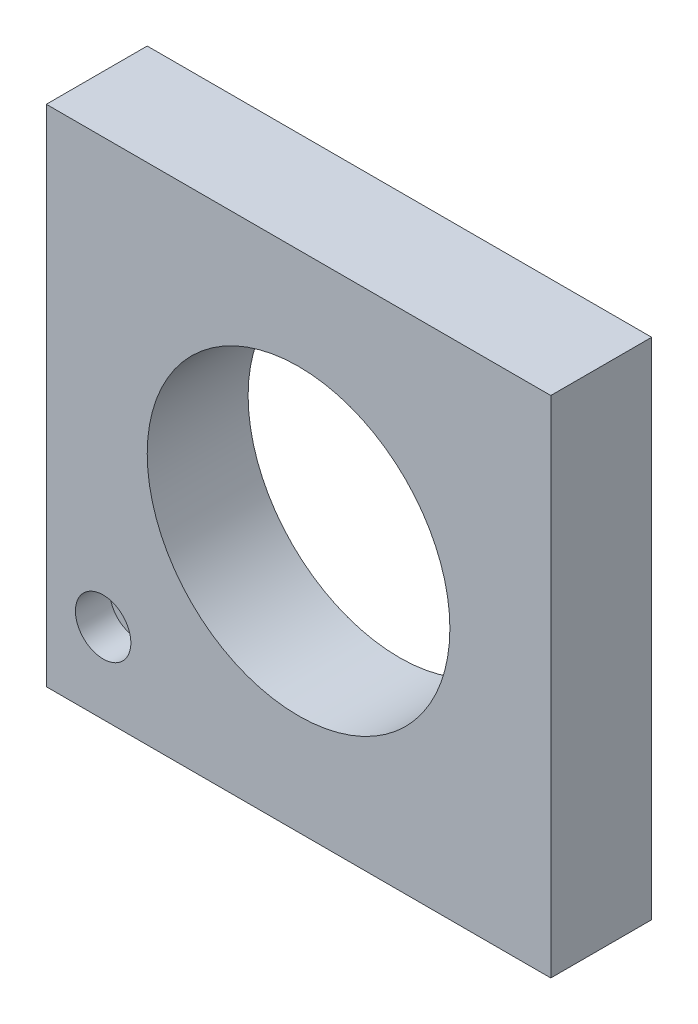
ISO-10303-21;
HEADER;
FILE_DESCRIPTION(('STEP AP214'),'2;1');
FILE_NAME('part.step','',(''),(''),'','','');
FILE_SCHEMA(('AUTOMOTIVE_DESIGN { 1 0 10303 214 1 1 1 1 }'));
ENDSEC;
DATA;
#1=APPLICATION_CONTEXT('core data for automotive mechanical design processes');
#2=APPLICATION_PROTOCOL_DEFINITION('international standard','automotive_design',2000,#1);
#3=PRODUCT_CONTEXT('',#1,'mechanical');
#4=PRODUCT('Part','Part','',(#3));
#5=PRODUCT_RELATED_PRODUCT_CATEGORY('part','',(#4));
#6=PRODUCT_DEFINITION_FORMATION('','',#4);
#7=PRODUCT_DEFINITION_CONTEXT('part definition',#1,'design');
#8=PRODUCT_DEFINITION('design','',#6,#7);
#9=PRODUCT_DEFINITION_SHAPE('','',#8);
#10=(LENGTH_UNIT() NAMED_UNIT(*) SI_UNIT(.MILLI.,.METRE.));
#11=(NAMED_UNIT(*) PLANE_ANGLE_UNIT() SI_UNIT($,.RADIAN.));
#12=(NAMED_UNIT(*) SI_UNIT($,.STERADIAN.) SOLID_ANGLE_UNIT());
#13=UNCERTAINTY_MEASURE_WITH_UNIT(LENGTH_MEASURE(1.E-05),#10,'distance_accuracy_value','');
#14=(GEOMETRIC_REPRESENTATION_CONTEXT(3) GLOBAL_UNCERTAINTY_ASSIGNED_CONTEXT((#13)) GLOBAL_UNIT_ASSIGNED_CONTEXT((#10,
#11,#12)) REPRESENTATION_CONTEXT('',''));
#15=CARTESIAN_POINT('',(0.,0.,0.));
#16=DIRECTION('',(0.,0.,1.));
#17=DIRECTION('',(1.,0.,0.));
#18=AXIS2_PLACEMENT_3D('',#15,#16,#17);
#19=CARTESIAN_POINT('',(50.,-50.,20.));
#20=DIRECTION('',(-1.,0.,0.));
#21=DIRECTION('',(0.,0.,1.));
#22=AXIS2_PLACEMENT_3D('',#19,#20,#21);
#23=PLANE('',#22);
#24=DIRECTION('',(0.,1.,0.));
#25=VECTOR('',#24,1.);
#26=CARTESIAN_POINT('',(50.,-50.,0.));
#27=LINE('',#26,#25);
#28=CARTESIAN_POINT('',(50.,-50.,0.));
#29=VERTEX_POINT('',#28);
#30=CARTESIAN_POINT('',(50.,50.,0.));
#31=VERTEX_POINT('',#30);
#32=EDGE_CURVE('E113',#29,#31,#27,.T.);
#33=ORIENTED_EDGE('',*,*,#32,.T.);
#34=DIRECTION('',(0.,0.,-1.));
#35=VECTOR('',#34,1.);
#36=CARTESIAN_POINT('',(50.,50.,20.));
#37=LINE('',#36,#35);
#38=CARTESIAN_POINT('',(50.,50.,20.));
#39=VERTEX_POINT('',#38);
#40=EDGE_CURVE('E11',#39,#31,#37,.T.);
#41=ORIENTED_EDGE('',*,*,#40,.F.);
#42=DIRECTION('',(0.,1.,0.));
#43=VECTOR('',#42,1.);
#44=CARTESIAN_POINT('',(50.,-50.,20.));
#45=LINE('',#44,#43);
#46=CARTESIAN_POINT('',(50.,-50.,20.));
#47=VERTEX_POINT('',#46);
#48=EDGE_CURVE('E97',#47,#39,#45,.T.);
#49=ORIENTED_EDGE('',*,*,#48,.F.);
#50=DIRECTION('',(0.,0.,-1.));
#51=VECTOR('',#50,1.);
#52=CARTESIAN_POINT('',(50.,-50.,20.));
#53=LINE('',#52,#51);
#54=EDGE_CURVE('E109',#47,#29,#53,.T.);
#55=ORIENTED_EDGE('',*,*,#54,.T.);
#56=EDGE_LOOP('',(#33,#41,#49,#55));
#57=FACE_BOUND('',#56,.T.);
#58=ADVANCED_FACE('F45',(#57),#23,.F.);
#59=CARTESIAN_POINT('',(-50.,50.,20.));
#60=DIRECTION('',(0.,-1.,0.));
#61=DIRECTION('',(0.,0.,-1.));
#62=AXIS2_PLACEMENT_3D('',#59,#60,#61);
#63=PLANE('',#62);
#64=DIRECTION('',(-1.,0.,0.));
#65=VECTOR('',#64,1.);
#66=CARTESIAN_POINT('',(-50.,50.,0.));
#67=LINE('',#66,#65);
#68=CARTESIAN_POINT('',(-50.,50.,0.));
#69=VERTEX_POINT('',#68);
#70=EDGE_CURVE('E102',#31,#69,#67,.T.);
#71=ORIENTED_EDGE('',*,*,#70,.T.);
#72=DIRECTION('',(0.,0.,-1.));
#73=VECTOR('',#72,1.);
#74=CARTESIAN_POINT('',(-50.,50.,20.));
#75=LINE('',#74,#73);
#76=CARTESIAN_POINT('',(-50.,50.,20.));
#77=VERTEX_POINT('',#76);
#78=EDGE_CURVE('E54',#77,#69,#75,.T.);
#79=ORIENTED_EDGE('',*,*,#78,.F.);
#80=DIRECTION('',(-1.,0.,0.));
#81=VECTOR('',#80,1.);
#82=CARTESIAN_POINT('',(-50.,50.,20.));
#83=LINE('',#82,#81);
#84=EDGE_CURVE('E92',#39,#77,#83,.T.);
#85=ORIENTED_EDGE('',*,*,#84,.F.);
#86=ORIENTED_EDGE('',*,*,#40,.T.);
#87=EDGE_LOOP('',(#71,#79,#85,#86));
#88=FACE_BOUND('',#87,.T.);
#89=ADVANCED_FACE('F101',(#88),#63,.F.);
#90=CARTESIAN_POINT('',(-50.,-50.,20.));
#91=DIRECTION('',(1.,0.,0.));
#92=DIRECTION('',(0.,0.,-1.));
#93=AXIS2_PLACEMENT_3D('',#90,#91,#92);
#94=PLANE('',#93);
#95=DIRECTION('',(0.,-1.,0.));
#96=VECTOR('',#95,1.);
#97=CARTESIAN_POINT('',(-50.,-50.,0.));
#98=LINE('',#97,#96);
#99=CARTESIAN_POINT('',(-50.,-50.,0.));
#100=VERTEX_POINT('',#99);
#101=EDGE_CURVE('E79',#69,#100,#98,.T.);
#102=ORIENTED_EDGE('',*,*,#101,.T.);
#103=DIRECTION('',(0.,0.,-1.));
#104=VECTOR('',#103,1.);
#105=CARTESIAN_POINT('',(-50.,-50.,20.));
#106=LINE('',#105,#104);
#107=CARTESIAN_POINT('',(-50.,-50.,20.));
#108=VERTEX_POINT('',#107);
#109=EDGE_CURVE('E104',#108,#100,#106,.T.);
#110=ORIENTED_EDGE('',*,*,#109,.F.);
#111=DIRECTION('',(0.,-1.,0.));
#112=VECTOR('',#111,1.);
#113=CARTESIAN_POINT('',(-50.,-50.,20.));
#114=LINE('',#113,#112);
#115=EDGE_CURVE('E95',#77,#108,#114,.T.);
#116=ORIENTED_EDGE('',*,*,#115,.F.);
#117=ORIENTED_EDGE('',*,*,#78,.T.);
#118=EDGE_LOOP('',(#102,#110,#116,#117));
#119=FACE_BOUND('',#118,.T.);
#120=ADVANCED_FACE('F105',(#119),#94,.F.);
#121=CARTESIAN_POINT('',(-50.,-50.,20.));
#122=DIRECTION('',(0.,1.,0.));
#123=DIRECTION('',(0.,0.,1.));
#124=AXIS2_PLACEMENT_3D('',#121,#122,#123);
#125=PLANE('',#124);
#126=DIRECTION('',(1.,0.,0.));
#127=VECTOR('',#126,1.);
#128=CARTESIAN_POINT('',(-50.,-50.,0.));
#129=LINE('',#128,#127);
#130=EDGE_CURVE('E85',#100,#29,#129,.T.);
#131=ORIENTED_EDGE('',*,*,#130,.T.);
#132=ORIENTED_EDGE('',*,*,#54,.F.);
#133=DIRECTION('',(1.,0.,0.));
#134=VECTOR('',#133,1.);
#135=CARTESIAN_POINT('',(-50.,-50.,20.));
#136=LINE('',#135,#134);
#137=EDGE_CURVE('E62',#108,#47,#136,.T.);
#138=ORIENTED_EDGE('',*,*,#137,.F.);
#139=ORIENTED_EDGE('',*,*,#109,.T.);
#140=EDGE_LOOP('',(#131,#132,#138,#139));
#141=FACE_BOUND('',#140,.T.);
#142=ADVANCED_FACE('F127',(#141),#125,.F.);
#143=CARTESIAN_POINT('',(0.,0.,20.));
#144=DIRECTION('',(0.,0.,-1.));
#145=DIRECTION('',(-1.,0.,0.));
#146=AXIS2_PLACEMENT_3D('',#143,#144,#145);
#147=PLANE('',#146);
#148=CARTESIAN_POINT('',(-38.736943886363,-34.1032488673534,20.));
#149=DIRECTION('',(0.,0.,1.));
#150=DIRECTION('',(1.,0.,0.));
#151=AXIS2_PLACEMENT_3D('',#148,#149,#150);
#152=CIRCLE('',#151,5.5);
#153=CARTESIAN_POINT('',(-33.236943886363,-34.1032488673534,20.));
#154=VERTEX_POINT('',#153);
#155=EDGE_CURVE('E157',#154,#154,#152,.T.);
#156=ORIENTED_EDGE('',*,*,#155,.F.);
#157=EDGE_LOOP('',(#156));
#158=FACE_BOUND('',#157,.T.);
#159=CARTESIAN_POINT('',(0.,0.,20.));
#160=DIRECTION('',(0.,0.,1.));
#161=DIRECTION('',(1.,0.,0.));
#162=AXIS2_PLACEMENT_3D('',#159,#160,#161);
#163=CIRCLE('',#162,30.);
#164=CARTESIAN_POINT('',(30.,0.,20.));
#165=VERTEX_POINT('',#164);
#166=EDGE_CURVE('E137',#165,#165,#163,.T.);
#167=ORIENTED_EDGE('',*,*,#166,.F.);
#168=EDGE_LOOP('',(#167));
#169=FACE_BOUND('',#168,.T.);
#170=ORIENTED_EDGE('',*,*,#48,.T.);
#171=ORIENTED_EDGE('',*,*,#84,.T.);
#172=ORIENTED_EDGE('',*,*,#115,.T.);
#173=ORIENTED_EDGE('',*,*,#137,.T.);
#174=EDGE_LOOP('',(#170,#171,#172,#173));
#175=FACE_BOUND('',#174,.T.);
#176=ADVANCED_FACE('F93',(#158,#169,#175),#147,.F.);
#177=CARTESIAN_POINT('',(0.,0.,0.));
#178=DIRECTION('',(0.,0.,-1.));
#179=DIRECTION('',(-1.,0.,0.));
#180=AXIS2_PLACEMENT_3D('',#177,#178,#179);
#181=PLANE('',#180);
#182=CARTESIAN_POINT('',(-38.736943886363,-34.1032488673534,0.));
#183=DIRECTION('',(0.,0.,1.));
#184=DIRECTION('',(1.,0.,0.));
#185=AXIS2_PLACEMENT_3D('',#182,#183,#184);
#186=CIRCLE('',#185,3.3);
#187=CARTESIAN_POINT('',(-35.436943886363,-34.1032488673534,0.));
#188=VERTEX_POINT('',#187);
#189=EDGE_CURVE('E141',#188,#188,#186,.T.);
#190=ORIENTED_EDGE('',*,*,#189,.T.);
#191=EDGE_LOOP('',(#190));
#192=FACE_BOUND('',#191,.T.);
#193=CARTESIAN_POINT('',(0.,0.,0.));
#194=DIRECTION('',(0.,0.,-1.));
#195=DIRECTION('',(-1.,0.,0.));
#196=AXIS2_PLACEMENT_3D('',#193,#194,#195);
#197=CIRCLE('',#196,30.);
#198=CARTESIAN_POINT('',(-30.,0.,0.));
#199=VERTEX_POINT('',#198);
#200=EDGE_CURVE('E117',#199,#199,#197,.F.);
#201=ORIENTED_EDGE('',*,*,#200,.T.);
#202=EDGE_LOOP('',(#201));
#203=FACE_BOUND('',#202,.T.);
#204=ORIENTED_EDGE('',*,*,#32,.F.);
#205=ORIENTED_EDGE('',*,*,#130,.F.);
#206=ORIENTED_EDGE('',*,*,#101,.F.);
#207=ORIENTED_EDGE('',*,*,#70,.F.);
#208=EDGE_LOOP('',(#204,#205,#206,#207));
#209=FACE_BOUND('',#208,.T.);
#210=ADVANCED_FACE('F130',(#192,#203,#209),#181,.T.);
#211=CARTESIAN_POINT('',(0.,0.,-84.8528137423857));
#212=DIRECTION('',(0.,0.,1.));
#213=DIRECTION('',(1.,0.,0.));
#214=AXIS2_PLACEMENT_3D('',#211,#212,#213);
#215=CYLINDRICAL_SURFACE('',#214,30.);
#216=ORIENTED_EDGE('',*,*,#166,.T.);
#217=EDGE_LOOP('',(#216));
#218=FACE_BOUND('',#217,.T.);
#219=ORIENTED_EDGE('',*,*,#200,.F.);
#220=EDGE_LOOP('',(#219));
#221=FACE_BOUND('',#220,.T.);
#222=ADVANCED_FACE('F169',(#218,#221),#215,.F.);
#223=CARTESIAN_POINT('',(-38.736943886363,-34.1032488673534,20.));
#224=DIRECTION('',(0.,0.,1.));
#225=DIRECTION('',(1.,0.,0.));
#226=AXIS2_PLACEMENT_3D('',#223,#224,#225);
#227=CYLINDRICAL_SURFACE('',#226,3.3);
#228=ORIENTED_EDGE('',*,*,#189,.F.);
#229=EDGE_LOOP('',(#228));
#230=FACE_BOUND('',#229,.T.);
#231=CARTESIAN_POINT('',(-38.736943886363,-34.1032488673534,13.1849784845243));
#232=DIRECTION('',(0.,0.,1.));
#233=DIRECTION('',(1.,0.,0.));
#234=AXIS2_PLACEMENT_3D('',#231,#232,#233);
#235=CIRCLE('',#234,3.3);
#236=CARTESIAN_POINT('',(-35.436943886363,-34.1032488673534,13.1849784845243));
#237=VERTEX_POINT('',#236);
#238=EDGE_CURVE('E145',#237,#237,#235,.T.);
#239=ORIENTED_EDGE('',*,*,#238,.T.);
#240=EDGE_LOOP('',(#239));
#241=FACE_BOUND('',#240,.T.);
#242=ADVANCED_FACE('F172',(#230,#241),#227,.F.);
#243=CARTESIAN_POINT('',(-38.736943886363,-34.1032488673534,13.2));
#244=DIRECTION('',(0.,0.,1.));
#245=DIRECTION('',(1.,0.,0.));
#246=AXIS2_PLACEMENT_3D('',#243,#244,#245);
#247=CONICAL_SURFACE('',#246,3.325,1.02974425867679);
#248=ORIENTED_EDGE('',*,*,#238,.F.);
#249=EDGE_LOOP('',(#248));
#250=FACE_BOUND('',#249,.T.);
#251=CARTESIAN_POINT('',(-38.736943886363,-34.1032488673534,13.2));
#252=DIRECTION('',(0.,0.,1.));
#253=DIRECTION('',(1.,0.,0.));
#254=AXIS2_PLACEMENT_3D('',#251,#252,#253);
#255=CIRCLE('',#254,3.325);
#256=CARTESIAN_POINT('',(-35.4119438863629,-34.1032488673534,13.2));
#257=VERTEX_POINT('',#256);
#258=EDGE_CURVE('E149',#257,#257,#255,.T.);
#259=ORIENTED_EDGE('',*,*,#258,.T.);
#260=EDGE_LOOP('',(#259));
#261=FACE_BOUND('',#260,.T.);
#262=ADVANCED_FACE('F219',(#250,#261),#247,.F.);
#263=CARTESIAN_POINT('',(-35.4119438863629,-34.1032488673534,13.2));
#264=DIRECTION('',(0.,0.,-1.));
#265=DIRECTION('',(-1.,0.,0.));
#266=AXIS2_PLACEMENT_3D('',#263,#264,#265);
#267=PLANE('',#266);
#268=ORIENTED_EDGE('',*,*,#258,.F.);
#269=EDGE_LOOP('',(#268));
#270=FACE_BOUND('',#269,.T.);
#271=CARTESIAN_POINT('',(-38.736943886363,-34.1032488673534,13.2));
#272=DIRECTION('',(0.,0.,1.));
#273=DIRECTION('',(1.,0.,0.));
#274=AXIS2_PLACEMENT_3D('',#271,#272,#273);
#275=CIRCLE('',#274,5.5);
#276=CARTESIAN_POINT('',(-33.236943886363,-34.1032488673534,13.2));
#277=VERTEX_POINT('',#276);
#278=EDGE_CURVE('E153',#277,#277,#275,.T.);
#279=ORIENTED_EDGE('',*,*,#278,.T.);
#280=EDGE_LOOP('',(#279));
#281=FACE_BOUND('',#280,.T.);
#282=ADVANCED_FACE('F228',(#270,#281),#267,.F.);
#283=CARTESIAN_POINT('',(-38.736943886363,-34.1032488673534,20.));
#284=DIRECTION('',(0.,0.,1.));
#285=DIRECTION('',(1.,0.,0.));
#286=AXIS2_PLACEMENT_3D('',#283,#284,#285);
#287=CYLINDRICAL_SURFACE('',#286,5.5);
#288=ORIENTED_EDGE('',*,*,#278,.F.);
#289=EDGE_LOOP('',(#288));
#290=FACE_BOUND('',#289,.T.);
#291=ORIENTED_EDGE('',*,*,#155,.T.);
#292=EDGE_LOOP('',(#291));
#293=FACE_BOUND('',#292,.T.);
#294=ADVANCED_FACE('F162',(#290,#293),#287,.F.);
#295=CLOSED_SHELL('',(#58,#89,#120,#142,#176,#210,#222,#242,#262,#282,#294));
#296=MANIFOLD_SOLID_BREP('B2',#295);
#297=ADVANCED_BREP_SHAPE_REPRESENTATION('',(#18,#296),#14);
#298=SHAPE_DEFINITION_REPRESENTATION(#9,#297);
ENDSEC;
END-ISO-10303-21;
